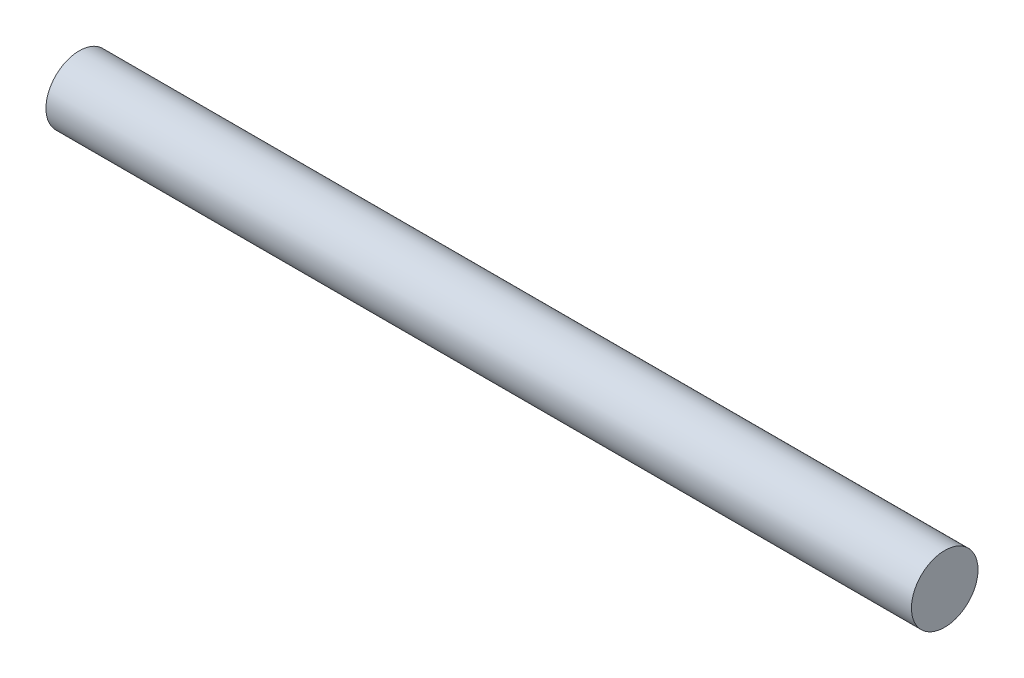
ISO-10303-21;
HEADER;
FILE_DESCRIPTION(('STEP AP214'),'2;1');
FILE_NAME('part.step','',(''),(''),'','','');
FILE_SCHEMA(('AUTOMOTIVE_DESIGN { 1 0 10303 214 1 1 1 1 }'));
ENDSEC;
DATA;
#1=APPLICATION_CONTEXT('core data for automotive mechanical design processes');
#2=APPLICATION_PROTOCOL_DEFINITION('international standard','automotive_design',2000,#1);
#3=PRODUCT_CONTEXT('',#1,'mechanical');
#4=PRODUCT('Part','Part','',(#3));
#5=PRODUCT_RELATED_PRODUCT_CATEGORY('part','',(#4));
#6=PRODUCT_DEFINITION_FORMATION('','',#4);
#7=PRODUCT_DEFINITION_CONTEXT('part definition',#1,'design');
#8=PRODUCT_DEFINITION('design','',#6,#7);
#9=PRODUCT_DEFINITION_SHAPE('','',#8);
#10=(LENGTH_UNIT() NAMED_UNIT(*) SI_UNIT(.MILLI.,.METRE.));
#11=(NAMED_UNIT(*) PLANE_ANGLE_UNIT() SI_UNIT($,.RADIAN.));
#12=(NAMED_UNIT(*) SI_UNIT($,.STERADIAN.) SOLID_ANGLE_UNIT());
#13=UNCERTAINTY_MEASURE_WITH_UNIT(LENGTH_MEASURE(1.E-05),#10,'distance_accuracy_value','');
#14=(GEOMETRIC_REPRESENTATION_CONTEXT(3) GLOBAL_UNCERTAINTY_ASSIGNED_CONTEXT((#13)) GLOBAL_UNIT_ASSIGNED_CONTEXT((#10,
#11,#12)) REPRESENTATION_CONTEXT('',''));
#15=CARTESIAN_POINT('',(0.,0.,0.));
#16=DIRECTION('',(0.,0.,1.));
#17=DIRECTION('',(1.,0.,0.));
#18=AXIS2_PLACEMENT_3D('',#15,#16,#17);
#19=CARTESIAN_POINT('',(19.5,0.,0.));
#20=DIRECTION('',(-1.,0.,0.));
#21=DIRECTION('',(0.,0.,1.));
#22=AXIS2_PLACEMENT_3D('',#19,#20,#21);
#23=CYLINDRICAL_SURFACE('',#22,1.5);
#24=CARTESIAN_POINT('',(19.5,0.,0.));
#25=DIRECTION('',(1.,0.,0.));
#26=DIRECTION('',(0.,0.,-1.));
#27=AXIS2_PLACEMENT_3D('',#24,#25,#26);
#28=CIRCLE('',#27,1.5);
#29=CARTESIAN_POINT('',(19.5,0.,-1.5));
#30=VERTEX_POINT('',#29);
#31=EDGE_CURVE('E10',#30,#30,#28,.T.);
#32=ORIENTED_EDGE('',*,*,#31,.F.);
#33=EDGE_LOOP('',(#32));
#34=FACE_BOUND('',#33,.T.);
#35=CARTESIAN_POINT('',(-19.5,0.,0.));
#36=DIRECTION('',(1.,0.,0.));
#37=DIRECTION('',(0.,0.,-1.));
#38=AXIS2_PLACEMENT_3D('',#35,#36,#37);
#39=CIRCLE('',#38,1.5);
#40=CARTESIAN_POINT('',(-19.5,0.,-1.5));
#41=VERTEX_POINT('',#40);
#42=EDGE_CURVE('E35',#41,#41,#39,.T.);
#43=ORIENTED_EDGE('',*,*,#42,.T.);
#44=EDGE_LOOP('',(#43));
#45=FACE_BOUND('',#44,.T.);
#46=ADVANCED_FACE('F32',(#34,#45),#23,.T.);
#47=CARTESIAN_POINT('',(19.5,0.,0.));
#48=DIRECTION('',(1.,0.,0.));
#49=DIRECTION('',(0.,0.,-1.));
#50=AXIS2_PLACEMENT_3D('',#47,#48,#49);
#51=PLANE('',#50);
#52=ORIENTED_EDGE('',*,*,#31,.T.);
#53=EDGE_LOOP('',(#52));
#54=FACE_BOUND('',#53,.T.);
#55=ADVANCED_FACE('F47',(#54),#51,.T.);
#56=CARTESIAN_POINT('',(-19.5,0.,0.));
#57=DIRECTION('',(1.,0.,0.));
#58=DIRECTION('',(0.,0.,-1.));
#59=AXIS2_PLACEMENT_3D('',#56,#57,#58);
#60=PLANE('',#59);
#61=ORIENTED_EDGE('',*,*,#42,.F.);
#62=EDGE_LOOP('',(#61));
#63=FACE_BOUND('',#62,.T.);
#64=ADVANCED_FACE('F45',(#63),#60,.F.);
#65=CLOSED_SHELL('',(#46,#55,#64));
#66=MANIFOLD_SOLID_BREP('B2',#65);
#67=ADVANCED_BREP_SHAPE_REPRESENTATION('',(#18,#66),#14);
#68=SHAPE_DEFINITION_REPRESENTATION(#9,#67);
ENDSEC;
END-ISO-10303-21;
